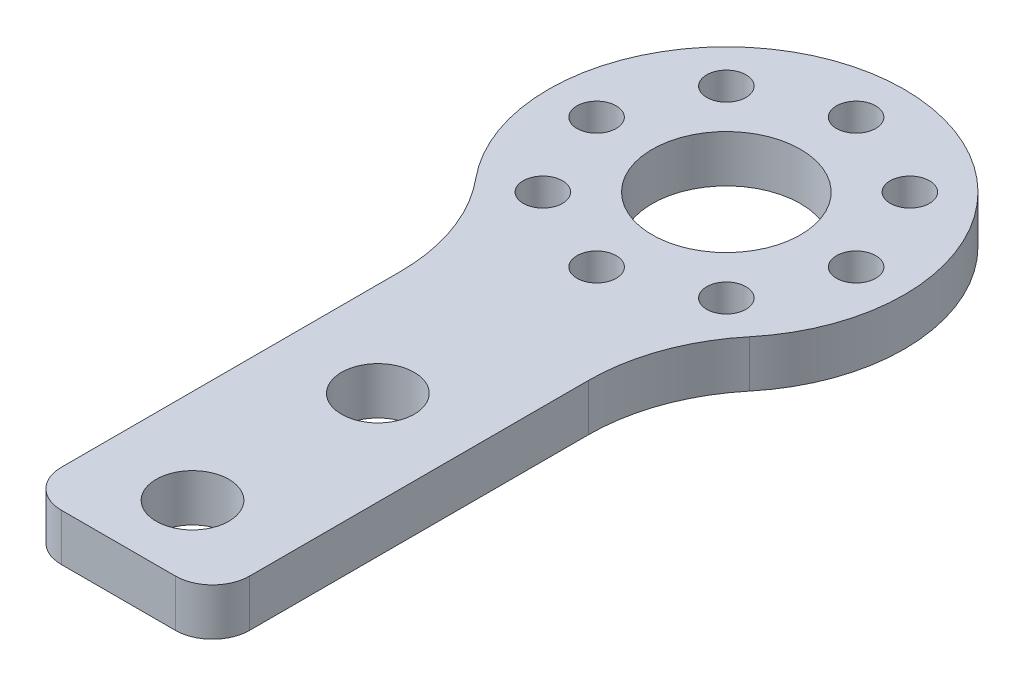
ISO-10303-21;
HEADER;
FILE_DESCRIPTION(('STEP AP214'),'2;1');
FILE_NAME('part.step','',(''),(''),'','','');
FILE_SCHEMA(('AUTOMOTIVE_DESIGN { 1 0 10303 214 1 1 1 1 }'));
ENDSEC;
DATA;
#1=APPLICATION_CONTEXT('core data for automotive mechanical design processes');
#2=APPLICATION_PROTOCOL_DEFINITION('international standard','automotive_design',2000,#1);
#3=PRODUCT_CONTEXT('',#1,'mechanical');
#4=PRODUCT('Part','Part','',(#3));
#5=PRODUCT_RELATED_PRODUCT_CATEGORY('part','',(#4));
#6=PRODUCT_DEFINITION_FORMATION('','',#4);
#7=PRODUCT_DEFINITION_CONTEXT('part definition',#1,'design');
#8=PRODUCT_DEFINITION('design','',#6,#7);
#9=PRODUCT_DEFINITION_SHAPE('','',#8);
#10=(LENGTH_UNIT() NAMED_UNIT(*) SI_UNIT(.MILLI.,.METRE.));
#11=(NAMED_UNIT(*) PLANE_ANGLE_UNIT() SI_UNIT($,.RADIAN.));
#12=(NAMED_UNIT(*) SI_UNIT($,.STERADIAN.) SOLID_ANGLE_UNIT());
#13=UNCERTAINTY_MEASURE_WITH_UNIT(LENGTH_MEASURE(1.E-05),#10,'distance_accuracy_value','');
#14=(GEOMETRIC_REPRESENTATION_CONTEXT(3) GLOBAL_UNCERTAINTY_ASSIGNED_CONTEXT((#13)) GLOBAL_UNIT_ASSIGNED_CONTEXT((#10,
#11,#12)) REPRESENTATION_CONTEXT('',''));
#15=CARTESIAN_POINT('',(0.,0.,0.));
#16=DIRECTION('',(0.,0.,1.));
#17=DIRECTION('',(1.,0.,0.));
#18=AXIS2_PLACEMENT_3D('',#15,#16,#17);
#19=CARTESIAN_POINT('',(12.7,6.35,82.));
#20=DIRECTION('',(-1.,0.,0.));
#21=DIRECTION('',(0.,0.,1.));
#22=AXIS2_PLACEMENT_3D('',#19,#20,#21);
#23=PLANE('',#22);
#24=DIRECTION('',(0.,0.,-1.));
#25=VECTOR('',#24,1.);
#26=CARTESIAN_POINT('',(12.7,6.35,82.));
#27=LINE('',#26,#25);
#28=CARTESIAN_POINT('',(12.7,6.35,77.));
#29=VERTEX_POINT('',#28);
#30=CARTESIAN_POINT('',(12.7,6.35,31.3003194871874));
#31=VERTEX_POINT('',#30);
#32=EDGE_CURVE('E162',#29,#31,#27,.T.);
#33=ORIENTED_EDGE('',*,*,#32,.F.);
#34=DIRECTION('',(0.,-1.,0.));
#35=VECTOR('',#34,1.);
#36=CARTESIAN_POINT('',(12.7,6.35,77.));
#37=LINE('',#36,#35);
#38=CARTESIAN_POINT('',(12.7,0.,77.));
#39=VERTEX_POINT('',#38);
#40=EDGE_CURVE('E147',#29,#39,#37,.T.);
#41=ORIENTED_EDGE('',*,*,#40,.T.);
#42=DIRECTION('',(0.,0.,-1.));
#43=VECTOR('',#42,1.);
#44=CARTESIAN_POINT('',(12.7,0.,82.));
#45=LINE('',#44,#43);
#46=CARTESIAN_POINT('',(12.7,0.,31.3003194871874));
#47=VERTEX_POINT('',#46);
#48=EDGE_CURVE('E171',#39,#47,#45,.T.);
#49=ORIENTED_EDGE('',*,*,#48,.T.);
#50=DIRECTION('',(0.,1.,0.));
#51=VECTOR('',#50,1.);
#52=CARTESIAN_POINT('',(12.7,6.35,31.3003194871874));
#53=LINE('',#52,#51);
#54=EDGE_CURVE('E125',#47,#31,#53,.T.);
#55=ORIENTED_EDGE('',*,*,#54,.T.);
#56=EDGE_LOOP('',(#33,#41,#49,#55));
#57=FACE_BOUND('',#56,.T.);
#58=ADVANCED_FACE('F40',(#57),#23,.F.);
#59=CARTESIAN_POINT('',(0.,6.35,0.));
#60=DIRECTION('',(0.,-1.,0.));
#61=DIRECTION('',(0.,0.,-1.));
#62=AXIS2_PLACEMENT_3D('',#59,#60,#61);
#63=CYLINDRICAL_SURFACE('',#62,24.);
#64=CARTESIAN_POINT('',(0.,0.,0.));
#65=DIRECTION('',(0.,1.,0.));
#66=DIRECTION('',(0.,0.,1.));
#67=AXIS2_PLACEMENT_3D('',#64,#65,#66);
#68=CIRCLE('',#67,24.);
#69=CARTESIAN_POINT('',(18.465306122449,0.,15.3307687284183));
#70=VERTEX_POINT('',#69);
#71=CARTESIAN_POINT('',(-18.465306122449,0.,15.3307687284183));
#72=VERTEX_POINT('',#71);
#73=EDGE_CURVE('E115',#70,#72,#68,.T.);
#74=ORIENTED_EDGE('',*,*,#73,.T.);
#75=DIRECTION('',(0.,-1.,0.));
#76=VECTOR('',#75,1.);
#77=CARTESIAN_POINT('',(-18.465306122449,6.35,15.3307687284183));
#78=LINE('',#77,#76);
#79=CARTESIAN_POINT('',(-18.465306122449,6.35,15.3307687284183));
#80=VERTEX_POINT('',#79);
#81=EDGE_CURVE('E123',#72,#80,#78,.F.);
#82=ORIENTED_EDGE('',*,*,#81,.T.);
#83=CARTESIAN_POINT('',(0.,6.35,0.));
#84=DIRECTION('',(0.,1.,0.));
#85=DIRECTION('',(0.,0.,1.));
#86=AXIS2_PLACEMENT_3D('',#83,#84,#85);
#87=CIRCLE('',#86,24.);
#88=CARTESIAN_POINT('',(18.465306122449,6.35,15.3307687284183));
#89=VERTEX_POINT('',#88);
#90=EDGE_CURVE('E168',#89,#80,#87,.T.);
#91=ORIENTED_EDGE('',*,*,#90,.F.);
#92=DIRECTION('',(0.,-1.,0.));
#93=VECTOR('',#92,1.);
#94=CARTESIAN_POINT('',(18.465306122449,6.35,15.3307687284183));
#95=LINE('',#94,#93);
#96=EDGE_CURVE('E130',#89,#70,#95,.T.);
#97=ORIENTED_EDGE('',*,*,#96,.T.);
#98=EDGE_LOOP('',(#74,#82,#91,#97));
#99=FACE_BOUND('',#98,.T.);
#100=ADVANCED_FACE('F183',(#99),#63,.T.);
#101=CARTESIAN_POINT('',(-12.7,6.35,82.));
#102=DIRECTION('',(-1.,0.,0.));
#103=DIRECTION('',(0.,0.,1.));
#104=AXIS2_PLACEMENT_3D('',#101,#102,#103);
#105=PLANE('',#104);
#106=DIRECTION('',(0.,0.,-1.));
#107=VECTOR('',#106,1.);
#108=CARTESIAN_POINT('',(-12.7,0.,82.));
#109=LINE('',#108,#107);
#110=CARTESIAN_POINT('',(-12.7,0.,77.));
#111=VERTEX_POINT('',#110);
#112=CARTESIAN_POINT('',(-12.7,0.,31.3003194871874));
#113=VERTEX_POINT('',#112);
#114=EDGE_CURVE('E104',#111,#113,#109,.T.);
#115=ORIENTED_EDGE('',*,*,#114,.F.);
#116=DIRECTION('',(0.,-1.,0.));
#117=VECTOR('',#116,1.);
#118=CARTESIAN_POINT('',(-12.7,6.35,77.));
#119=LINE('',#118,#117);
#120=CARTESIAN_POINT('',(-12.7,6.35,77.));
#121=VERTEX_POINT('',#120);
#122=EDGE_CURVE('E11',#111,#121,#119,.F.);
#123=ORIENTED_EDGE('',*,*,#122,.T.);
#124=DIRECTION('',(0.,0.,-1.));
#125=VECTOR('',#124,1.);
#126=CARTESIAN_POINT('',(-12.7,6.35,82.));
#127=LINE('',#126,#125);
#128=CARTESIAN_POINT('',(-12.7,6.35,31.3003194871874));
#129=VERTEX_POINT('',#128);
#130=EDGE_CURVE('E128',#121,#129,#127,.T.);
#131=ORIENTED_EDGE('',*,*,#130,.T.);
#132=DIRECTION('',(0.,-1.,0.));
#133=VECTOR('',#132,1.);
#134=CARTESIAN_POINT('',(-12.7,6.35,31.3003194871874));
#135=LINE('',#134,#133);
#136=EDGE_CURVE('E122',#129,#113,#135,.T.);
#137=ORIENTED_EDGE('',*,*,#136,.T.);
#138=EDGE_LOOP('',(#115,#123,#131,#137));
#139=FACE_BOUND('',#138,.T.);
#140=ADVANCED_FACE('F127',(#139),#105,.T.);
#141=CARTESIAN_POINT('',(-12.7,6.35,82.));
#142=DIRECTION('',(0.,0.,-1.));
#143=DIRECTION('',(-1.,0.,0.));
#144=AXIS2_PLACEMENT_3D('',#141,#142,#143);
#145=PLANE('',#144);
#146=DIRECTION('',(1.,0.,0.));
#147=VECTOR('',#146,1.);
#148=CARTESIAN_POINT('',(-12.7,0.,82.));
#149=LINE('',#148,#147);
#150=CARTESIAN_POINT('',(-7.7,0.,82.));
#151=VERTEX_POINT('',#150);
#152=CARTESIAN_POINT('',(7.7,0.,82.));
#153=VERTEX_POINT('',#152);
#154=EDGE_CURVE('E114',#151,#153,#149,.T.);
#155=ORIENTED_EDGE('',*,*,#154,.T.);
#156=DIRECTION('',(0.,-1.,0.));
#157=VECTOR('',#156,1.);
#158=CARTESIAN_POINT('',(7.7,6.35,82.));
#159=LINE('',#158,#157);
#160=CARTESIAN_POINT('',(7.7,6.35,82.));
#161=VERTEX_POINT('',#160);
#162=EDGE_CURVE('E61',#153,#161,#159,.F.);
#163=ORIENTED_EDGE('',*,*,#162,.T.);
#164=DIRECTION('',(1.,0.,0.));
#165=VECTOR('',#164,1.);
#166=CARTESIAN_POINT('',(-12.7,6.35,82.));
#167=LINE('',#166,#165);
#168=CARTESIAN_POINT('',(-7.7,6.35,82.));
#169=VERTEX_POINT('',#168);
#170=EDGE_CURVE('E131',#169,#161,#167,.T.);
#171=ORIENTED_EDGE('',*,*,#170,.F.);
#172=DIRECTION('',(0.,-1.,0.));
#173=VECTOR('',#172,1.);
#174=CARTESIAN_POINT('',(-7.7,0.,82.));
#175=LINE('',#174,#173);
#176=EDGE_CURVE('E153',#169,#151,#175,.T.);
#177=ORIENTED_EDGE('',*,*,#176,.T.);
#178=EDGE_LOOP('',(#155,#163,#171,#177));
#179=FACE_BOUND('',#178,.T.);
#180=ADVANCED_FACE('F172',(#179),#145,.F.);
#181=CARTESIAN_POINT('',(0.,6.35,0.));
#182=DIRECTION('',(0.,1.,0.));
#183=DIRECTION('',(0.,0.,1.));
#184=AXIS2_PLACEMENT_3D('',#181,#182,#183);
#185=PLANE('',#184);
#186=CARTESIAN_POINT('',(0.,6.35,47.));
#187=DIRECTION('',(0.,-1.,0.));
#188=DIRECTION('',(0.,0.,-1.));
#189=AXIS2_PLACEMENT_3D('',#186,#187,#188);
#190=CIRCLE('',#189,4.9022);
#191=CARTESIAN_POINT('',(0.,6.35,42.0978));
#192=VERTEX_POINT('',#191);
#193=EDGE_CURVE('E260',#192,#192,#190,.T.);
#194=ORIENTED_EDGE('',*,*,#193,.T.);
#195=EDGE_LOOP('',(#194));
#196=FACE_BOUND('',#195,.T.);
#197=CARTESIAN_POINT('',(0.,6.35,72.));
#198=DIRECTION('',(0.,-1.,0.));
#199=DIRECTION('',(0.,0.,-1.));
#200=AXIS2_PLACEMENT_3D('',#197,#198,#199);
#201=CIRCLE('',#200,4.9022);
#202=CARTESIAN_POINT('',(0.,6.35,67.0978));
#203=VERTEX_POINT('',#202);
#204=EDGE_CURVE('E270',#203,#203,#201,.T.);
#205=ORIENTED_EDGE('',*,*,#204,.T.);
#206=EDGE_LOOP('',(#205));
#207=FACE_BOUND('',#206,.T.);
#208=CARTESIAN_POINT('',(0.,6.35,0.));
#209=DIRECTION('',(0.,-1.,0.));
#210=DIRECTION('',(0.,0.,-1.));
#211=AXIS2_PLACEMENT_3D('',#208,#209,#210);
#212=CIRCLE('',#211,10.);
#213=CARTESIAN_POINT('',(0.,6.35,-10.));
#214=VERTEX_POINT('',#213);
#215=EDGE_CURVE('E274',#214,#214,#212,.T.);
#216=ORIENTED_EDGE('',*,*,#215,.T.);
#217=EDGE_LOOP('',(#216));
#218=FACE_BOUND('',#217,.T.);
#219=CARTESIAN_POINT('',(0.,6.35,-17.5));
#220=DIRECTION('',(0.,-1.,0.));
#221=DIRECTION('',(0.,0.,-1.));
#222=AXIS2_PLACEMENT_3D('',#219,#220,#221);
#223=CIRCLE('',#222,2.65);
#224=CARTESIAN_POINT('',(0.,6.35,-20.15));
#225=VERTEX_POINT('',#224);
#226=EDGE_CURVE('E282',#225,#225,#223,.T.);
#227=ORIENTED_EDGE('',*,*,#226,.T.);
#228=EDGE_LOOP('',(#227));
#229=FACE_BOUND('',#228,.T.);
#230=CARTESIAN_POINT('',(-12.3743686707646,6.35,-12.3743686707646));
#231=DIRECTION('',(0.,-1.,0.));
#232=DIRECTION('',(0.,0.,-1.));
#233=AXIS2_PLACEMENT_3D('',#230,#231,#232);
#234=CIRCLE('',#233,2.65);
#235=CARTESIAN_POINT('',(-12.3743686707646,6.35,-15.0243686707646));
#236=VERTEX_POINT('',#235);
#237=EDGE_CURVE('E288',#236,#236,#234,.T.);
#238=ORIENTED_EDGE('',*,*,#237,.T.);
#239=EDGE_LOOP('',(#238));
#240=FACE_BOUND('',#239,.T.);
#241=CARTESIAN_POINT('',(-17.5,6.35,0.));
#242=DIRECTION('',(0.,-1.,0.));
#243=DIRECTION('',(0.,0.,-1.));
#244=AXIS2_PLACEMENT_3D('',#241,#242,#243);
#245=CIRCLE('',#244,2.65);
#246=CARTESIAN_POINT('',(-17.5,6.35,-2.65));
#247=VERTEX_POINT('',#246);
#248=EDGE_CURVE('E294',#247,#247,#245,.T.);
#249=ORIENTED_EDGE('',*,*,#248,.T.);
#250=EDGE_LOOP('',(#249));
#251=FACE_BOUND('',#250,.T.);
#252=CARTESIAN_POINT('',(-12.3743686707646,6.35,12.3743686707646));
#253=DIRECTION('',(0.,-1.,0.));
#254=DIRECTION('',(0.,0.,-1.));
#255=AXIS2_PLACEMENT_3D('',#252,#253,#254);
#256=CIRCLE('',#255,2.65);
#257=CARTESIAN_POINT('',(-12.3743686707646,6.35,9.72436867076458));
#258=VERTEX_POINT('',#257);
#259=EDGE_CURVE('E300',#258,#258,#256,.T.);
#260=ORIENTED_EDGE('',*,*,#259,.T.);
#261=EDGE_LOOP('',(#260));
#262=FACE_BOUND('',#261,.T.);
#263=CARTESIAN_POINT('',(0.,6.35,17.5));
#264=DIRECTION('',(0.,-1.,0.));
#265=DIRECTION('',(0.,0.,-1.));
#266=AXIS2_PLACEMENT_3D('',#263,#264,#265);
#267=CIRCLE('',#266,2.65);
#268=CARTESIAN_POINT('',(0.,6.35,14.85));
#269=VERTEX_POINT('',#268);
#270=EDGE_CURVE('E306',#269,#269,#267,.T.);
#271=ORIENTED_EDGE('',*,*,#270,.T.);
#272=EDGE_LOOP('',(#271));
#273=FACE_BOUND('',#272,.T.);
#274=CARTESIAN_POINT('',(12.3743686707646,6.35,12.3743686707646));
#275=DIRECTION('',(0.,-1.,0.));
#276=DIRECTION('',(0.,0.,-1.));
#277=AXIS2_PLACEMENT_3D('',#274,#275,#276);
#278=CIRCLE('',#277,2.65);
#279=CARTESIAN_POINT('',(12.3743686707646,6.35,9.72436867076458));
#280=VERTEX_POINT('',#279);
#281=EDGE_CURVE('E312',#280,#280,#278,.T.);
#282=ORIENTED_EDGE('',*,*,#281,.T.);
#283=EDGE_LOOP('',(#282));
#284=FACE_BOUND('',#283,.T.);
#285=CARTESIAN_POINT('',(17.5,6.35,0.));
#286=DIRECTION('',(0.,-1.,0.));
#287=DIRECTION('',(0.,0.,-1.));
#288=AXIS2_PLACEMENT_3D('',#285,#286,#287);
#289=CIRCLE('',#288,2.65);
#290=CARTESIAN_POINT('',(17.5,6.35,-2.65));
#291=VERTEX_POINT('',#290);
#292=EDGE_CURVE('E318',#291,#291,#289,.T.);
#293=ORIENTED_EDGE('',*,*,#292,.T.);
#294=EDGE_LOOP('',(#293));
#295=FACE_BOUND('',#294,.T.);
#296=CARTESIAN_POINT('',(12.3743686707646,6.35,-12.3743686707646));
#297=DIRECTION('',(0.,-1.,0.));
#298=DIRECTION('',(0.,0.,-1.));
#299=AXIS2_PLACEMENT_3D('',#296,#297,#298);
#300=CIRCLE('',#299,2.65);
#301=CARTESIAN_POINT('',(12.3743686707646,6.35,-15.0243686707646));
#302=VERTEX_POINT('',#301);
#303=EDGE_CURVE('E181',#302,#302,#300,.T.);
#304=ORIENTED_EDGE('',*,*,#303,.T.);
#305=EDGE_LOOP('',(#304));
#306=FACE_BOUND('',#305,.T.);
#307=ORIENTED_EDGE('',*,*,#170,.T.);
#308=CARTESIAN_POINT('',(7.7,6.35,77.));
#309=DIRECTION('',(0.,1.,0.));
#310=DIRECTION('',(0.,0.,1.));
#311=AXIS2_PLACEMENT_3D('',#308,#309,#310);
#312=CIRCLE('',#311,5.);
#313=EDGE_CURVE('E48',#161,#29,#312,.T.);
#314=ORIENTED_EDGE('',*,*,#313,.T.);
#315=ORIENTED_EDGE('',*,*,#32,.T.);
#316=CARTESIAN_POINT('',(37.7,6.35,31.3003194871874));
#317=DIRECTION('',(0.,1.,0.));
#318=DIRECTION('',(0.,0.,1.));
#319=AXIS2_PLACEMENT_3D('',#316,#317,#318);
#320=CIRCLE('',#319,25.);
#321=EDGE_CURVE('E145',#31,#89,#320,.F.);
#322=ORIENTED_EDGE('',*,*,#321,.T.);
#323=ORIENTED_EDGE('',*,*,#90,.T.);
#324=CARTESIAN_POINT('',(-37.7,6.35,31.3003194871874));
#325=DIRECTION('',(0.,1.,0.));
#326=DIRECTION('',(0.,0.,1.));
#327=AXIS2_PLACEMENT_3D('',#324,#325,#326);
#328=CIRCLE('',#327,25.);
#329=EDGE_CURVE('E124',#80,#129,#328,.F.);
#330=ORIENTED_EDGE('',*,*,#329,.T.);
#331=ORIENTED_EDGE('',*,*,#130,.F.);
#332=CARTESIAN_POINT('',(-7.7,6.35,77.));
#333=DIRECTION('',(0.,1.,0.));
#334=DIRECTION('',(0.,0.,1.));
#335=AXIS2_PLACEMENT_3D('',#332,#333,#334);
#336=CIRCLE('',#335,5.);
#337=EDGE_CURVE('E157',#121,#169,#336,.T.);
#338=ORIENTED_EDGE('',*,*,#337,.T.);
#339=EDGE_LOOP('',(#307,#314,#315,#322,#323,#330,#331,#338));
#340=FACE_BOUND('',#339,.T.);
#341=ADVANCED_FACE('F161',(#196,#207,#218,#229,#240,#251,#262,#273,#284,#295,#306,#340),#185,.T.);
#342=CARTESIAN_POINT('',(0.,0.,0.));
#343=DIRECTION('',(0.,1.,0.));
#344=DIRECTION('',(0.,0.,1.));
#345=AXIS2_PLACEMENT_3D('',#342,#343,#344);
#346=PLANE('',#345);
#347=CARTESIAN_POINT('',(0.,0.,47.));
#348=DIRECTION('',(0.,-1.,0.));
#349=DIRECTION('',(0.,0.,-1.));
#350=AXIS2_PLACEMENT_3D('',#347,#348,#349);
#351=CIRCLE('',#350,4.9022);
#352=CARTESIAN_POINT('',(0.,0.,42.0978));
#353=VERTEX_POINT('',#352);
#354=EDGE_CURVE('E263',#353,#353,#351,.T.);
#355=ORIENTED_EDGE('',*,*,#354,.F.);
#356=EDGE_LOOP('',(#355));
#357=FACE_BOUND('',#356,.T.);
#358=CARTESIAN_POINT('',(0.,0.,72.));
#359=DIRECTION('',(0.,-1.,0.));
#360=DIRECTION('',(0.,0.,-1.));
#361=AXIS2_PLACEMENT_3D('',#358,#359,#360);
#362=CIRCLE('',#361,4.9022);
#363=CARTESIAN_POINT('',(0.,0.,67.0978));
#364=VERTEX_POINT('',#363);
#365=EDGE_CURVE('E265',#364,#364,#362,.T.);
#366=ORIENTED_EDGE('',*,*,#365,.F.);
#367=EDGE_LOOP('',(#366));
#368=FACE_BOUND('',#367,.T.);
#369=CARTESIAN_POINT('',(0.,0.,0.));
#370=DIRECTION('',(0.,-1.,0.));
#371=DIRECTION('',(0.,0.,-1.));
#372=AXIS2_PLACEMENT_3D('',#369,#370,#371);
#373=CIRCLE('',#372,10.);
#374=CARTESIAN_POINT('',(0.,0.,-10.));
#375=VERTEX_POINT('',#374);
#376=EDGE_CURVE('E273',#375,#375,#373,.T.);
#377=ORIENTED_EDGE('',*,*,#376,.F.);
#378=EDGE_LOOP('',(#377));
#379=FACE_BOUND('',#378,.T.);
#380=CARTESIAN_POINT('',(0.,0.,-17.5));
#381=DIRECTION('',(0.,-1.,0.));
#382=DIRECTION('',(0.,0.,-1.));
#383=AXIS2_PLACEMENT_3D('',#380,#381,#382);
#384=CIRCLE('',#383,2.64999999999999);
#385=CARTESIAN_POINT('',(0.,0.,-20.15));
#386=VERTEX_POINT('',#385);
#387=EDGE_CURVE('E277',#386,#386,#384,.T.);
#388=ORIENTED_EDGE('',*,*,#387,.F.);
#389=EDGE_LOOP('',(#388));
#390=FACE_BOUND('',#389,.T.);
#391=CARTESIAN_POINT('',(-12.3743686707646,0.,-12.3743686707646));
#392=DIRECTION('',(0.,-1.,0.));
#393=DIRECTION('',(0.,0.,-1.));
#394=AXIS2_PLACEMENT_3D('',#391,#392,#393);
#395=CIRCLE('',#394,2.64999999999999);
#396=CARTESIAN_POINT('',(-12.3743686707646,0.,-15.0243686707646));
#397=VERTEX_POINT('',#396);
#398=EDGE_CURVE('E285',#397,#397,#395,.T.);
#399=ORIENTED_EDGE('',*,*,#398,.F.);
#400=EDGE_LOOP('',(#399));
#401=FACE_BOUND('',#400,.T.);
#402=CARTESIAN_POINT('',(-17.5,0.,0.));
#403=DIRECTION('',(0.,-1.,0.));
#404=DIRECTION('',(0.,0.,-1.));
#405=AXIS2_PLACEMENT_3D('',#402,#403,#404);
#406=CIRCLE('',#405,2.64999999999999);
#407=CARTESIAN_POINT('',(-17.5,0.,-2.64999999999999));
#408=VERTEX_POINT('',#407);
#409=EDGE_CURVE('E291',#408,#408,#406,.T.);
#410=ORIENTED_EDGE('',*,*,#409,.F.);
#411=EDGE_LOOP('',(#410));
#412=FACE_BOUND('',#411,.T.);
#413=CARTESIAN_POINT('',(-12.3743686707646,0.,12.3743686707646));
#414=DIRECTION('',(0.,-1.,0.));
#415=DIRECTION('',(0.,0.,-1.));
#416=AXIS2_PLACEMENT_3D('',#413,#414,#415);
#417=CIRCLE('',#416,2.64999999999999);
#418=CARTESIAN_POINT('',(-12.3743686707646,0.,9.72436867076459));
#419=VERTEX_POINT('',#418);
#420=EDGE_CURVE('E297',#419,#419,#417,.T.);
#421=ORIENTED_EDGE('',*,*,#420,.F.);
#422=EDGE_LOOP('',(#421));
#423=FACE_BOUND('',#422,.T.);
#424=CARTESIAN_POINT('',(0.,0.,17.5));
#425=DIRECTION('',(0.,-1.,0.));
#426=DIRECTION('',(0.,0.,-1.));
#427=AXIS2_PLACEMENT_3D('',#424,#425,#426);
#428=CIRCLE('',#427,2.64999999999999);
#429=CARTESIAN_POINT('',(0.,0.,14.85));
#430=VERTEX_POINT('',#429);
#431=EDGE_CURVE('E303',#430,#430,#428,.T.);
#432=ORIENTED_EDGE('',*,*,#431,.F.);
#433=EDGE_LOOP('',(#432));
#434=FACE_BOUND('',#433,.T.);
#435=CARTESIAN_POINT('',(12.3743686707646,0.,12.3743686707646));
#436=DIRECTION('',(0.,-1.,0.));
#437=DIRECTION('',(0.,0.,-1.));
#438=AXIS2_PLACEMENT_3D('',#435,#436,#437);
#439=CIRCLE('',#438,2.64999999999999);
#440=CARTESIAN_POINT('',(12.3743686707646,0.,9.7243686707646));
#441=VERTEX_POINT('',#440);
#442=EDGE_CURVE('E309',#441,#441,#439,.T.);
#443=ORIENTED_EDGE('',*,*,#442,.F.);
#444=EDGE_LOOP('',(#443));
#445=FACE_BOUND('',#444,.T.);
#446=CARTESIAN_POINT('',(17.5,0.,0.));
#447=DIRECTION('',(0.,-1.,0.));
#448=DIRECTION('',(0.,0.,-1.));
#449=AXIS2_PLACEMENT_3D('',#446,#447,#448);
#450=CIRCLE('',#449,2.64999999999999);
#451=CARTESIAN_POINT('',(17.5,0.,-2.64999999999999));
#452=VERTEX_POINT('',#451);
#453=EDGE_CURVE('E315',#452,#452,#450,.T.);
#454=ORIENTED_EDGE('',*,*,#453,.F.);
#455=EDGE_LOOP('',(#454));
#456=FACE_BOUND('',#455,.T.);
#457=CARTESIAN_POINT('',(12.3743686707646,0.,-12.3743686707646));
#458=DIRECTION('',(0.,-1.,0.));
#459=DIRECTION('',(0.,0.,-1.));
#460=AXIS2_PLACEMENT_3D('',#457,#458,#459);
#461=CIRCLE('',#460,2.64999999999999);
#462=CARTESIAN_POINT('',(12.3743686707646,0.,-15.0243686707646));
#463=VERTEX_POINT('',#462);
#464=EDGE_CURVE('E321',#463,#463,#461,.T.);
#465=ORIENTED_EDGE('',*,*,#464,.F.);
#466=EDGE_LOOP('',(#465));
#467=FACE_BOUND('',#466,.T.);
#468=ORIENTED_EDGE('',*,*,#48,.F.);
#469=CARTESIAN_POINT('',(7.7,0.,77.));
#470=DIRECTION('',(0.,1.,0.));
#471=DIRECTION('',(0.,0.,1.));
#472=AXIS2_PLACEMENT_3D('',#469,#470,#471);
#473=CIRCLE('',#472,5.);
#474=EDGE_CURVE('E151',#39,#153,#473,.F.);
#475=ORIENTED_EDGE('',*,*,#474,.T.);
#476=ORIENTED_EDGE('',*,*,#154,.F.);
#477=CARTESIAN_POINT('',(-7.7,0.,77.));
#478=DIRECTION('',(0.,1.,0.));
#479=DIRECTION('',(0.,0.,1.));
#480=AXIS2_PLACEMENT_3D('',#477,#478,#479);
#481=CIRCLE('',#480,5.);
#482=EDGE_CURVE('E112',#151,#111,#481,.F.);
#483=ORIENTED_EDGE('',*,*,#482,.T.);
#484=ORIENTED_EDGE('',*,*,#114,.T.);
#485=CARTESIAN_POINT('',(-37.7,0.,31.3003194871874));
#486=DIRECTION('',(0.,1.,0.));
#487=DIRECTION('',(0.,0.,1.));
#488=AXIS2_PLACEMENT_3D('',#485,#486,#487);
#489=CIRCLE('',#488,25.);
#490=EDGE_CURVE('E109',#113,#72,#489,.T.);
#491=ORIENTED_EDGE('',*,*,#490,.T.);
#492=ORIENTED_EDGE('',*,*,#73,.F.);
#493=CARTESIAN_POINT('',(37.7,0.,31.3003194871874));
#494=DIRECTION('',(0.,1.,0.));
#495=DIRECTION('',(0.,0.,1.));
#496=AXIS2_PLACEMENT_3D('',#493,#494,#495);
#497=CIRCLE('',#496,25.);
#498=EDGE_CURVE('E142',#70,#47,#497,.T.);
#499=ORIENTED_EDGE('',*,*,#498,.T.);
#500=EDGE_LOOP('',(#468,#475,#476,#483,#484,#491,#492,#499));
#501=FACE_BOUND('',#500,.T.);
#502=ADVANCED_FACE('F107',(#357,#368,#379,#390,#401,#412,#423,#434,#445,#456,#467,#501),#346,.F.);
#503=CARTESIAN_POINT('',(12.3743686707646,0.,-12.3743686707646));
#504=DIRECTION('',(0.,-1.,0.));
#505=DIRECTION('',(0.,0.,-1.));
#506=AXIS2_PLACEMENT_3D('',#503,#504,#505);
#507=CYLINDRICAL_SURFACE('',#506,2.64999999999999);
#508=ORIENTED_EDGE('',*,*,#303,.F.);
#509=EDGE_LOOP('',(#508));
#510=FACE_BOUND('',#509,.T.);
#511=ORIENTED_EDGE('',*,*,#464,.T.);
#512=EDGE_LOOP('',(#511));
#513=FACE_BOUND('',#512,.T.);
#514=ADVANCED_FACE('F209',(#510,#513),#507,.F.);
#515=CARTESIAN_POINT('',(17.5,0.,0.));
#516=DIRECTION('',(0.,-1.,0.));
#517=DIRECTION('',(0.,0.,-1.));
#518=AXIS2_PLACEMENT_3D('',#515,#516,#517);
#519=CYLINDRICAL_SURFACE('',#518,2.64999999999999);
#520=ORIENTED_EDGE('',*,*,#292,.F.);
#521=EDGE_LOOP('',(#520));
#522=FACE_BOUND('',#521,.T.);
#523=ORIENTED_EDGE('',*,*,#453,.T.);
#524=EDGE_LOOP('',(#523));
#525=FACE_BOUND('',#524,.T.);
#526=ADVANCED_FACE('F216',(#522,#525),#519,.F.);
#527=CARTESIAN_POINT('',(12.3743686707646,0.,12.3743686707646));
#528=DIRECTION('',(0.,-1.,0.));
#529=DIRECTION('',(0.,0.,-1.));
#530=AXIS2_PLACEMENT_3D('',#527,#528,#529);
#531=CYLINDRICAL_SURFACE('',#530,2.64999999999999);
#532=ORIENTED_EDGE('',*,*,#281,.F.);
#533=EDGE_LOOP('',(#532));
#534=FACE_BOUND('',#533,.T.);
#535=ORIENTED_EDGE('',*,*,#442,.T.);
#536=EDGE_LOOP('',(#535));
#537=FACE_BOUND('',#536,.T.);
#538=ADVANCED_FACE('F220',(#534,#537),#531,.F.);
#539=CARTESIAN_POINT('',(0.,0.,17.5));
#540=DIRECTION('',(0.,-1.,0.));
#541=DIRECTION('',(0.,0.,-1.));
#542=AXIS2_PLACEMENT_3D('',#539,#540,#541);
#543=CYLINDRICAL_SURFACE('',#542,2.64999999999999);
#544=ORIENTED_EDGE('',*,*,#270,.F.);
#545=EDGE_LOOP('',(#544));
#546=FACE_BOUND('',#545,.T.);
#547=ORIENTED_EDGE('',*,*,#431,.T.);
#548=EDGE_LOOP('',(#547));
#549=FACE_BOUND('',#548,.T.);
#550=ADVANCED_FACE('F224',(#546,#549),#543,.F.);
#551=CARTESIAN_POINT('',(-12.3743686707646,0.,12.3743686707646));
#552=DIRECTION('',(0.,-1.,0.));
#553=DIRECTION('',(0.,0.,-1.));
#554=AXIS2_PLACEMENT_3D('',#551,#552,#553);
#555=CYLINDRICAL_SURFACE('',#554,2.64999999999999);
#556=ORIENTED_EDGE('',*,*,#259,.F.);
#557=EDGE_LOOP('',(#556));
#558=FACE_BOUND('',#557,.T.);
#559=ORIENTED_EDGE('',*,*,#420,.T.);
#560=EDGE_LOOP('',(#559));
#561=FACE_BOUND('',#560,.T.);
#562=ADVANCED_FACE('F228',(#558,#561),#555,.F.);
#563=CARTESIAN_POINT('',(-17.5,0.,0.));
#564=DIRECTION('',(0.,-1.,0.));
#565=DIRECTION('',(0.,0.,-1.));
#566=AXIS2_PLACEMENT_3D('',#563,#564,#565);
#567=CYLINDRICAL_SURFACE('',#566,2.64999999999999);
#568=ORIENTED_EDGE('',*,*,#248,.F.);
#569=EDGE_LOOP('',(#568));
#570=FACE_BOUND('',#569,.T.);
#571=ORIENTED_EDGE('',*,*,#409,.T.);
#572=EDGE_LOOP('',(#571));
#573=FACE_BOUND('',#572,.T.);
#574=ADVANCED_FACE('F232',(#570,#573),#567,.F.);
#575=CARTESIAN_POINT('',(-12.3743686707646,0.,-12.3743686707646));
#576=DIRECTION('',(0.,-1.,0.));
#577=DIRECTION('',(0.,0.,-1.));
#578=AXIS2_PLACEMENT_3D('',#575,#576,#577);
#579=CYLINDRICAL_SURFACE('',#578,2.64999999999999);
#580=ORIENTED_EDGE('',*,*,#237,.F.);
#581=EDGE_LOOP('',(#580));
#582=FACE_BOUND('',#581,.T.);
#583=ORIENTED_EDGE('',*,*,#398,.T.);
#584=EDGE_LOOP('',(#583));
#585=FACE_BOUND('',#584,.T.);
#586=ADVANCED_FACE('F236',(#582,#585),#579,.F.);
#587=CARTESIAN_POINT('',(0.,0.,-17.5));
#588=DIRECTION('',(0.,-1.,0.));
#589=DIRECTION('',(0.,0.,-1.));
#590=AXIS2_PLACEMENT_3D('',#587,#588,#589);
#591=CYLINDRICAL_SURFACE('',#590,2.64999999999999);
#592=ORIENTED_EDGE('',*,*,#226,.F.);
#593=EDGE_LOOP('',(#592));
#594=FACE_BOUND('',#593,.T.);
#595=ORIENTED_EDGE('',*,*,#387,.T.);
#596=EDGE_LOOP('',(#595));
#597=FACE_BOUND('',#596,.T.);
#598=ADVANCED_FACE('F240',(#594,#597),#591,.F.);
#599=CARTESIAN_POINT('',(0.,6.35,0.));
#600=DIRECTION('',(0.,-1.,0.));
#601=DIRECTION('',(0.,0.,-1.));
#602=AXIS2_PLACEMENT_3D('',#599,#600,#601);
#603=CYLINDRICAL_SURFACE('',#602,10.);
#604=ORIENTED_EDGE('',*,*,#215,.F.);
#605=EDGE_LOOP('',(#604));
#606=FACE_BOUND('',#605,.T.);
#607=ORIENTED_EDGE('',*,*,#376,.T.);
#608=EDGE_LOOP('',(#607));
#609=FACE_BOUND('',#608,.T.);
#610=ADVANCED_FACE('F194',(#606,#609),#603,.F.);
#611=CARTESIAN_POINT('',(-37.7,6.35,31.3003194871874));
#612=DIRECTION('',(0.,-1.,0.));
#613=DIRECTION('',(0.,0.,-1.));
#614=AXIS2_PLACEMENT_3D('',#611,#612,#613);
#615=CYLINDRICAL_SURFACE('',#614,25.);
#616=ORIENTED_EDGE('',*,*,#329,.F.);
#617=ORIENTED_EDGE('',*,*,#81,.F.);
#618=ORIENTED_EDGE('',*,*,#490,.F.);
#619=ORIENTED_EDGE('',*,*,#136,.F.);
#620=EDGE_LOOP('',(#616,#617,#618,#619));
#621=FACE_BOUND('',#620,.T.);
#622=ADVANCED_FACE('F121',(#621),#615,.F.);
#623=CARTESIAN_POINT('',(37.7,6.35,31.3003194871874));
#624=DIRECTION('',(0.,-1.,0.));
#625=DIRECTION('',(0.,0.,-1.));
#626=AXIS2_PLACEMENT_3D('',#623,#624,#625);
#627=CYLINDRICAL_SURFACE('',#626,25.);
#628=ORIENTED_EDGE('',*,*,#321,.F.);
#629=ORIENTED_EDGE('',*,*,#54,.F.);
#630=ORIENTED_EDGE('',*,*,#498,.F.);
#631=ORIENTED_EDGE('',*,*,#96,.F.);
#632=EDGE_LOOP('',(#628,#629,#630,#631));
#633=FACE_BOUND('',#632,.T.);
#634=ADVANCED_FACE('F187',(#633),#627,.F.);
#635=CARTESIAN_POINT('',(7.7,6.35,77.));
#636=DIRECTION('',(0.,-1.,0.));
#637=DIRECTION('',(0.,0.,-1.));
#638=AXIS2_PLACEMENT_3D('',#635,#636,#637);
#639=CYLINDRICAL_SURFACE('',#638,5.);
#640=ORIENTED_EDGE('',*,*,#313,.F.);
#641=ORIENTED_EDGE('',*,*,#162,.F.);
#642=ORIENTED_EDGE('',*,*,#474,.F.);
#643=ORIENTED_EDGE('',*,*,#40,.F.);
#644=EDGE_LOOP('',(#640,#641,#642,#643));
#645=FACE_BOUND('',#644,.T.);
#646=ADVANCED_FACE('F170',(#645),#639,.T.);
#647=CARTESIAN_POINT('',(-7.7,6.35,77.));
#648=DIRECTION('',(0.,1.,0.));
#649=DIRECTION('',(0.,0.,1.));
#650=AXIS2_PLACEMENT_3D('',#647,#648,#649);
#651=CYLINDRICAL_SURFACE('',#650,5.);
#652=ORIENTED_EDGE('',*,*,#337,.F.);
#653=ORIENTED_EDGE('',*,*,#122,.F.);
#654=ORIENTED_EDGE('',*,*,#482,.F.);
#655=ORIENTED_EDGE('',*,*,#176,.F.);
#656=EDGE_LOOP('',(#652,#653,#654,#655));
#657=FACE_BOUND('',#656,.T.);
#658=ADVANCED_FACE('F42',(#657),#651,.T.);
#659=CARTESIAN_POINT('',(0.,0.,72.));
#660=DIRECTION('',(0.,-1.,0.));
#661=DIRECTION('',(0.,0.,-1.));
#662=AXIS2_PLACEMENT_3D('',#659,#660,#661);
#663=CYLINDRICAL_SURFACE('',#662,4.9022);
#664=ORIENTED_EDGE('',*,*,#204,.F.);
#665=EDGE_LOOP('',(#664));
#666=FACE_BOUND('',#665,.T.);
#667=ORIENTED_EDGE('',*,*,#365,.T.);
#668=EDGE_LOOP('',(#667));
#669=FACE_BOUND('',#668,.T.);
#670=ADVANCED_FACE('F248',(#666,#669),#663,.F.);
#671=CARTESIAN_POINT('',(0.,0.,47.));
#672=DIRECTION('',(0.,-1.,0.));
#673=DIRECTION('',(0.,0.,-1.));
#674=AXIS2_PLACEMENT_3D('',#671,#672,#673);
#675=CYLINDRICAL_SURFACE('',#674,4.9022);
#676=ORIENTED_EDGE('',*,*,#193,.F.);
#677=EDGE_LOOP('',(#676));
#678=FACE_BOUND('',#677,.T.);
#679=ORIENTED_EDGE('',*,*,#354,.T.);
#680=EDGE_LOOP('',(#679));
#681=FACE_BOUND('',#680,.T.);
#682=ADVANCED_FACE('F251',(#678,#681),#675,.F.);
#683=CLOSED_SHELL('',(#58,#100,#140,#180,#341,#502,#514,#526,#538,#550,#562,#574,#586,#598,#610,
#622,#634,#646,#658,#670,#682));
#684=MANIFOLD_SOLID_BREP('B2',#683);
#685=ADVANCED_BREP_SHAPE_REPRESENTATION('',(#18,#684),#14);
#686=SHAPE_DEFINITION_REPRESENTATION(#9,#685);
ENDSEC;
END-ISO-10303-21;
